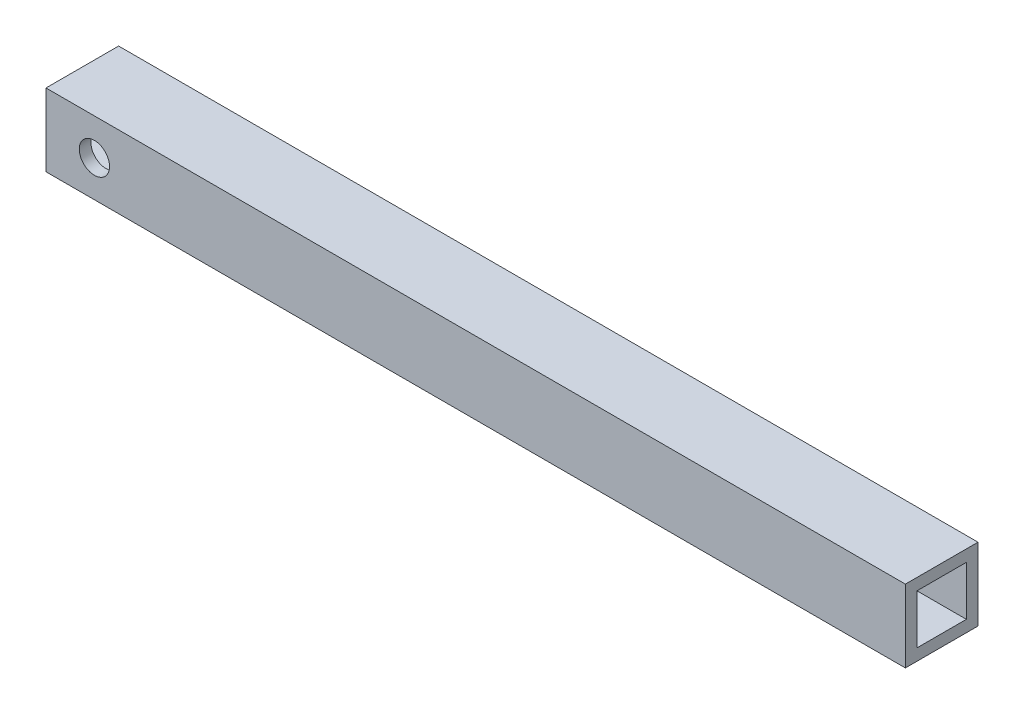
ISO-10303-21;
HEADER;
FILE_DESCRIPTION(('STEP AP214'),'2;1');
FILE_NAME('part.step','',(''),(''),'','','');
FILE_SCHEMA(('AUTOMOTIVE_DESIGN { 1 0 10303 214 1 1 1 1 }'));
ENDSEC;
DATA;
#1=APPLICATION_CONTEXT('core data for automotive mechanical design processes');
#2=APPLICATION_PROTOCOL_DEFINITION('international standard','automotive_design',2000,#1);
#3=PRODUCT_CONTEXT('',#1,'mechanical');
#4=PRODUCT('Part','Part','',(#3));
#5=PRODUCT_RELATED_PRODUCT_CATEGORY('part','',(#4));
#6=PRODUCT_DEFINITION_FORMATION('','',#4);
#7=PRODUCT_DEFINITION_CONTEXT('part definition',#1,'design');
#8=PRODUCT_DEFINITION('design','',#6,#7);
#9=PRODUCT_DEFINITION_SHAPE('','',#8);
#10=(LENGTH_UNIT() NAMED_UNIT(*) SI_UNIT(.MILLI.,.METRE.));
#11=(NAMED_UNIT(*) PLANE_ANGLE_UNIT() SI_UNIT($,.RADIAN.));
#12=(NAMED_UNIT(*) SI_UNIT($,.STERADIAN.) SOLID_ANGLE_UNIT());
#13=UNCERTAINTY_MEASURE_WITH_UNIT(LENGTH_MEASURE(1.E-05),#10,'distance_accuracy_value','');
#14=(GEOMETRIC_REPRESENTATION_CONTEXT(3) GLOBAL_UNCERTAINTY_ASSIGNED_CONTEXT((#13)) GLOBAL_UNIT_ASSIGNED_CONTEXT((#10,
#11,#12)) REPRESENTATION_CONTEXT('',''));
#15=CARTESIAN_POINT('',(0.,0.,0.));
#16=DIRECTION('',(0.,0.,1.));
#17=DIRECTION('',(1.,0.,0.));
#18=AXIS2_PLACEMENT_3D('',#15,#16,#17);
#19=CARTESIAN_POINT('',(112.7125,9.525,-9.525));
#20=DIRECTION('',(0.,0.,1.));
#21=DIRECTION('',(0.,-1.,0.));
#22=AXIS2_PLACEMENT_3D('',#19,#20,#21);
#23=PLANE('',#22);
#24=CARTESIAN_POINT('',(-100.0125,0.,-9.525));
#25=DIRECTION('',(0.,0.,-1.));
#26=DIRECTION('',(0.,1.,0.));
#27=AXIS2_PLACEMENT_3D('',#24,#25,#26);
#28=CIRCLE('',#27,3.96875);
#29=CARTESIAN_POINT('',(-100.0125,3.96875,-9.525));
#30=VERTEX_POINT('',#29);
#31=EDGE_CURVE('E249',#30,#30,#28,.T.);
#32=ORIENTED_EDGE('',*,*,#31,.F.);
#33=EDGE_LOOP('',(#32));
#34=FACE_BOUND('',#33,.T.);
#35=DIRECTION('',(0.,1.,0.));
#36=VECTOR('',#35,1.);
#37=CARTESIAN_POINT('',(-112.7125,9.525,-9.525));
#38=LINE('',#37,#36);
#39=CARTESIAN_POINT('',(-112.7125,-9.525,-9.525));
#40=VERTEX_POINT('',#39);
#41=CARTESIAN_POINT('',(-112.7125,9.525,-9.525));
#42=VERTEX_POINT('',#41);
#43=EDGE_CURVE('E165',#40,#42,#38,.T.);
#44=ORIENTED_EDGE('',*,*,#43,.T.);
#45=DIRECTION('',(-1.,0.,0.));
#46=VECTOR('',#45,1.);
#47=CARTESIAN_POINT('',(112.7125,9.525,-9.525));
#48=LINE('',#47,#46);
#49=CARTESIAN_POINT('',(112.7125,9.525,-9.525));
#50=VERTEX_POINT('',#49);
#51=EDGE_CURVE('E11',#50,#42,#48,.T.);
#52=ORIENTED_EDGE('',*,*,#51,.F.);
#53=DIRECTION('',(0.,1.,0.));
#54=VECTOR('',#53,1.);
#55=CARTESIAN_POINT('',(112.7125,9.525,-9.525));
#56=LINE('',#55,#54);
#57=CARTESIAN_POINT('',(112.7125,-9.525,-9.525));
#58=VERTEX_POINT('',#57);
#59=EDGE_CURVE('E150',#58,#50,#56,.T.);
#60=ORIENTED_EDGE('',*,*,#59,.F.);
#61=DIRECTION('',(-1.,0.,0.));
#62=VECTOR('',#61,1.);
#63=CARTESIAN_POINT('',(112.7125,-9.525,-9.525));
#64=LINE('',#63,#62);
#65=EDGE_CURVE('E164',#58,#40,#64,.T.);
#66=ORIENTED_EDGE('',*,*,#65,.T.);
#67=EDGE_LOOP('',(#44,#52,#60,#66));
#68=FACE_BOUND('',#67,.T.);
#69=ADVANCED_FACE('F41',(#34,#68),#23,.F.);
#70=CARTESIAN_POINT('',(112.7125,9.525,9.525));
#71=DIRECTION('',(0.,-1.,0.));
#72=DIRECTION('',(0.,0.,-1.));
#73=AXIS2_PLACEMENT_3D('',#70,#71,#72);
#74=PLANE('',#73);
#75=DIRECTION('',(0.,0.,1.));
#76=VECTOR('',#75,1.);
#77=CARTESIAN_POINT('',(-112.7125,9.525,9.525));
#78=LINE('',#77,#76);
#79=CARTESIAN_POINT('',(-112.7125,9.525,9.525));
#80=VERTEX_POINT('',#79);
#81=EDGE_CURVE('E169',#42,#80,#78,.T.);
#82=ORIENTED_EDGE('',*,*,#81,.T.);
#83=DIRECTION('',(-1.,0.,0.));
#84=VECTOR('',#83,1.);
#85=CARTESIAN_POINT('',(112.7125,9.525,9.525));
#86=LINE('',#85,#84);
#87=CARTESIAN_POINT('',(112.7125,9.525,9.525));
#88=VERTEX_POINT('',#87);
#89=EDGE_CURVE('E50',#88,#80,#86,.T.);
#90=ORIENTED_EDGE('',*,*,#89,.F.);
#91=DIRECTION('',(0.,0.,1.));
#92=VECTOR('',#91,1.);
#93=CARTESIAN_POINT('',(112.7125,9.525,9.525));
#94=LINE('',#93,#92);
#95=EDGE_CURVE('E154',#50,#88,#94,.T.);
#96=ORIENTED_EDGE('',*,*,#95,.F.);
#97=ORIENTED_EDGE('',*,*,#51,.T.);
#98=EDGE_LOOP('',(#82,#90,#96,#97));
#99=FACE_BOUND('',#98,.T.);
#100=ADVANCED_FACE('F204',(#99),#74,.F.);
#101=CARTESIAN_POINT('',(112.7125,9.525,9.525));
#102=DIRECTION('',(0.,0.,-1.));
#103=DIRECTION('',(0.,1.,0.));
#104=AXIS2_PLACEMENT_3D('',#101,#102,#103);
#105=PLANE('',#104);
#106=CARTESIAN_POINT('',(-100.0125,0.,9.525));
#107=DIRECTION('',(0.,0.,-1.));
#108=DIRECTION('',(0.,1.,0.));
#109=AXIS2_PLACEMENT_3D('',#106,#107,#108);
#110=CIRCLE('',#109,3.96875);
#111=CARTESIAN_POINT('',(-100.0125,3.96875,9.525));
#112=VERTEX_POINT('',#111);
#113=EDGE_CURVE('E247',#112,#112,#110,.F.);
#114=ORIENTED_EDGE('',*,*,#113,.F.);
#115=EDGE_LOOP('',(#114));
#116=FACE_BOUND('',#115,.T.);
#117=DIRECTION('',(0.,-1.,0.));
#118=VECTOR('',#117,1.);
#119=CARTESIAN_POINT('',(-112.7125,9.525,9.525));
#120=LINE('',#119,#118);
#121=CARTESIAN_POINT('',(-112.7125,-9.525,9.525));
#122=VERTEX_POINT('',#121);
#123=EDGE_CURVE('E172',#80,#122,#120,.T.);
#124=ORIENTED_EDGE('',*,*,#123,.T.);
#125=DIRECTION('',(-1.,0.,0.));
#126=VECTOR('',#125,1.);
#127=CARTESIAN_POINT('',(112.7125,-9.525,9.525));
#128=LINE('',#127,#126);
#129=CARTESIAN_POINT('',(112.7125,-9.525,9.525));
#130=VERTEX_POINT('',#129);
#131=EDGE_CURVE('E180',#130,#122,#128,.T.);
#132=ORIENTED_EDGE('',*,*,#131,.F.);
#133=DIRECTION('',(0.,-1.,0.));
#134=VECTOR('',#133,1.);
#135=CARTESIAN_POINT('',(112.7125,9.525,9.525));
#136=LINE('',#135,#134);
#137=EDGE_CURVE('E158',#88,#130,#136,.T.);
#138=ORIENTED_EDGE('',*,*,#137,.F.);
#139=ORIENTED_EDGE('',*,*,#89,.T.);
#140=EDGE_LOOP('',(#124,#132,#138,#139));
#141=FACE_BOUND('',#140,.T.);
#142=ADVANCED_FACE('F190',(#116,#141),#105,.F.);
#143=CARTESIAN_POINT('',(112.7125,-9.525,9.525));
#144=DIRECTION('',(0.,1.,0.));
#145=DIRECTION('',(0.,0.,1.));
#146=AXIS2_PLACEMENT_3D('',#143,#144,#145);
#147=PLANE('',#146);
#148=DIRECTION('',(0.,0.,-1.));
#149=VECTOR('',#148,1.);
#150=CARTESIAN_POINT('',(-112.7125,-9.525,9.525));
#151=LINE('',#150,#149);
#152=EDGE_CURVE('E155',#122,#40,#151,.T.);
#153=ORIENTED_EDGE('',*,*,#152,.T.);
#154=ORIENTED_EDGE('',*,*,#65,.F.);
#155=DIRECTION('',(0.,0.,-1.));
#156=VECTOR('',#155,1.);
#157=CARTESIAN_POINT('',(112.7125,-9.525,9.525));
#158=LINE('',#157,#156);
#159=EDGE_CURVE('E161',#130,#58,#158,.T.);
#160=ORIENTED_EDGE('',*,*,#159,.F.);
#161=ORIENTED_EDGE('',*,*,#131,.T.);
#162=EDGE_LOOP('',(#153,#154,#160,#161));
#163=FACE_BOUND('',#162,.T.);
#164=ADVANCED_FACE('F197',(#163),#147,.F.);
#165=CARTESIAN_POINT('',(112.7125,0.,0.));
#166=DIRECTION('',(1.,0.,0.));
#167=DIRECTION('',(0.,0.,-1.));
#168=AXIS2_PLACEMENT_3D('',#165,#166,#167);
#169=PLANE('',#168);
#170=DIRECTION('',(0.,1.,0.));
#171=VECTOR('',#170,1.);
#172=CARTESIAN_POINT('',(112.7125,9.525,-6.477));
#173=LINE('',#172,#171);
#174=CARTESIAN_POINT('',(112.7125,-6.477,-6.477));
#175=VERTEX_POINT('',#174);
#176=CARTESIAN_POINT('',(112.7125,6.477,-6.477));
#177=VERTEX_POINT('',#176);
#178=EDGE_CURVE('E132',#175,#177,#173,.T.);
#179=ORIENTED_EDGE('',*,*,#178,.F.);
#180=DIRECTION('',(0.,0.,-1.));
#181=VECTOR('',#180,1.);
#182=CARTESIAN_POINT('',(112.7125,-6.477,9.525));
#183=LINE('',#182,#181);
#184=CARTESIAN_POINT('',(112.7125,-6.477,6.477));
#185=VERTEX_POINT('',#184);
#186=EDGE_CURVE('E112',#185,#175,#183,.T.);
#187=ORIENTED_EDGE('',*,*,#186,.F.);
#188=DIRECTION('',(0.,-1.,0.));
#189=VECTOR('',#188,1.);
#190=CARTESIAN_POINT('',(112.7125,9.525,6.477));
#191=LINE('',#190,#189);
#192=CARTESIAN_POINT('',(112.7125,6.477,6.477));
#193=VERTEX_POINT('',#192);
#194=EDGE_CURVE('E145',#193,#185,#191,.T.);
#195=ORIENTED_EDGE('',*,*,#194,.F.);
#196=DIRECTION('',(0.,0.,1.));
#197=VECTOR('',#196,1.);
#198=CARTESIAN_POINT('',(112.7125,6.477,9.525));
#199=LINE('',#198,#197);
#200=EDGE_CURVE('E136',#177,#193,#199,.T.);
#201=ORIENTED_EDGE('',*,*,#200,.F.);
#202=EDGE_LOOP('',(#179,#187,#195,#201));
#203=FACE_BOUND('',#202,.T.);
#204=ORIENTED_EDGE('',*,*,#59,.T.);
#205=ORIENTED_EDGE('',*,*,#95,.T.);
#206=ORIENTED_EDGE('',*,*,#137,.T.);
#207=ORIENTED_EDGE('',*,*,#159,.T.);
#208=EDGE_LOOP('',(#204,#205,#206,#207));
#209=FACE_BOUND('',#208,.T.);
#210=ADVANCED_FACE('F203',(#203,#209),#169,.T.);
#211=CARTESIAN_POINT('',(-112.7125,0.,0.));
#212=DIRECTION('',(1.,0.,0.));
#213=DIRECTION('',(0.,0.,-1.));
#214=AXIS2_PLACEMENT_3D('',#211,#212,#213);
#215=PLANE('',#214);
#216=DIRECTION('',(0.,0.,-1.));
#217=VECTOR('',#216,1.);
#218=CARTESIAN_POINT('',(-112.7125,-6.477,9.525));
#219=LINE('',#218,#217);
#220=CARTESIAN_POINT('',(-112.7125,-6.477,6.477));
#221=VERTEX_POINT('',#220);
#222=CARTESIAN_POINT('',(-112.7125,-6.477,-6.477));
#223=VERTEX_POINT('',#222);
#224=EDGE_CURVE('E110',#221,#223,#219,.T.);
#225=ORIENTED_EDGE('',*,*,#224,.T.);
#226=DIRECTION('',(0.,1.,0.));
#227=VECTOR('',#226,1.);
#228=CARTESIAN_POINT('',(-112.7125,9.525,-6.477));
#229=LINE('',#228,#227);
#230=CARTESIAN_POINT('',(-112.7125,6.477,-6.477));
#231=VERTEX_POINT('',#230);
#232=EDGE_CURVE('E119',#223,#231,#229,.T.);
#233=ORIENTED_EDGE('',*,*,#232,.T.);
#234=DIRECTION('',(0.,0.,1.));
#235=VECTOR('',#234,1.);
#236=CARTESIAN_POINT('',(-112.7125,6.477,9.525));
#237=LINE('',#236,#235);
#238=CARTESIAN_POINT('',(-112.7125,6.477,6.477));
#239=VERTEX_POINT('',#238);
#240=EDGE_CURVE('E126',#231,#239,#237,.T.);
#241=ORIENTED_EDGE('',*,*,#240,.T.);
#242=DIRECTION('',(0.,-1.,0.));
#243=VECTOR('',#242,1.);
#244=CARTESIAN_POINT('',(-112.7125,9.525,6.477));
#245=LINE('',#244,#243);
#246=EDGE_CURVE('E64',#239,#221,#245,.T.);
#247=ORIENTED_EDGE('',*,*,#246,.T.);
#248=EDGE_LOOP('',(#225,#233,#241,#247));
#249=FACE_BOUND('',#248,.T.);
#250=ORIENTED_EDGE('',*,*,#43,.F.);
#251=ORIENTED_EDGE('',*,*,#152,.F.);
#252=ORIENTED_EDGE('',*,*,#123,.F.);
#253=ORIENTED_EDGE('',*,*,#81,.F.);
#254=EDGE_LOOP('',(#250,#251,#252,#253));
#255=FACE_BOUND('',#254,.T.);
#256=ADVANCED_FACE('F129',(#249,#255),#215,.F.);
#257=CARTESIAN_POINT('',(112.7125,9.525,-6.477));
#258=DIRECTION('',(0.,0.,1.));
#259=DIRECTION('',(0.,-1.,0.));
#260=AXIS2_PLACEMENT_3D('',#257,#258,#259);
#261=PLANE('',#260);
#262=CARTESIAN_POINT('',(-100.0125,0.,-6.477));
#263=DIRECTION('',(0.,0.,1.));
#264=DIRECTION('',(0.,-1.,0.));
#265=AXIS2_PLACEMENT_3D('',#262,#263,#264);
#266=CIRCLE('',#265,3.96875);
#267=CARTESIAN_POINT('',(-100.0125,3.96875,-6.477));
#268=VERTEX_POINT('',#267);
#269=EDGE_CURVE('E127',#268,#268,#266,.T.);
#270=ORIENTED_EDGE('',*,*,#269,.F.);
#271=EDGE_LOOP('',(#270));
#272=FACE_BOUND('',#271,.T.);
#273=ORIENTED_EDGE('',*,*,#232,.F.);
#274=DIRECTION('',(-1.,0.,0.));
#275=VECTOR('',#274,1.);
#276=CARTESIAN_POINT('',(112.7125,-6.477,-6.477));
#277=LINE('',#276,#275);
#278=EDGE_CURVE('E106',#175,#223,#277,.T.);
#279=ORIENTED_EDGE('',*,*,#278,.F.);
#280=ORIENTED_EDGE('',*,*,#178,.T.);
#281=DIRECTION('',(-1.,0.,0.));
#282=VECTOR('',#281,1.);
#283=CARTESIAN_POINT('',(112.7125,6.477,-6.477));
#284=LINE('',#283,#282);
#285=EDGE_CURVE('E122',#177,#231,#284,.T.);
#286=ORIENTED_EDGE('',*,*,#285,.T.);
#287=EDGE_LOOP('',(#273,#279,#280,#286));
#288=FACE_BOUND('',#287,.T.);
#289=ADVANCED_FACE('F120',(#272,#288),#261,.T.);
#290=CARTESIAN_POINT('',(112.7125,6.477,9.525));
#291=DIRECTION('',(0.,-1.,0.));
#292=DIRECTION('',(0.,0.,-1.));
#293=AXIS2_PLACEMENT_3D('',#290,#291,#292);
#294=PLANE('',#293);
#295=ORIENTED_EDGE('',*,*,#240,.F.);
#296=ORIENTED_EDGE('',*,*,#285,.F.);
#297=ORIENTED_EDGE('',*,*,#200,.T.);
#298=DIRECTION('',(-1.,0.,0.));
#299=VECTOR('',#298,1.);
#300=CARTESIAN_POINT('',(112.7125,6.477,6.477));
#301=LINE('',#300,#299);
#302=EDGE_CURVE('E260',#193,#239,#301,.T.);
#303=ORIENTED_EDGE('',*,*,#302,.T.);
#304=EDGE_LOOP('',(#295,#296,#297,#303));
#305=FACE_BOUND('',#304,.T.);
#306=ADVANCED_FACE('F227',(#305),#294,.T.);
#307=CARTESIAN_POINT('',(112.7125,9.525,6.477));
#308=DIRECTION('',(0.,0.,-1.));
#309=DIRECTION('',(0.,1.,0.));
#310=AXIS2_PLACEMENT_3D('',#307,#308,#309);
#311=PLANE('',#310);
#312=CARTESIAN_POINT('',(-100.0125,0.,6.477));
#313=DIRECTION('',(0.,0.,-1.));
#314=DIRECTION('',(0.,1.,0.));
#315=AXIS2_PLACEMENT_3D('',#312,#313,#314);
#316=CIRCLE('',#315,3.96875);
#317=CARTESIAN_POINT('',(-100.0125,3.96875,6.477));
#318=VERTEX_POINT('',#317);
#319=EDGE_CURVE('E44',#318,#318,#316,.T.);
#320=ORIENTED_EDGE('',*,*,#319,.F.);
#321=EDGE_LOOP('',(#320));
#322=FACE_BOUND('',#321,.T.);
#323=ORIENTED_EDGE('',*,*,#246,.F.);
#324=ORIENTED_EDGE('',*,*,#302,.F.);
#325=ORIENTED_EDGE('',*,*,#194,.T.);
#326=DIRECTION('',(-1.,0.,0.));
#327=VECTOR('',#326,1.);
#328=CARTESIAN_POINT('',(112.7125,-6.477,6.477));
#329=LINE('',#328,#327);
#330=EDGE_CURVE('E57',#185,#221,#329,.T.);
#331=ORIENTED_EDGE('',*,*,#330,.T.);
#332=EDGE_LOOP('',(#323,#324,#325,#331));
#333=FACE_BOUND('',#332,.T.);
#334=ADVANCED_FACE('F224',(#322,#333),#311,.T.);
#335=CARTESIAN_POINT('',(112.7125,-6.477,9.525));
#336=DIRECTION('',(0.,1.,0.));
#337=DIRECTION('',(0.,0.,1.));
#338=AXIS2_PLACEMENT_3D('',#335,#336,#337);
#339=PLANE('',#338);
#340=ORIENTED_EDGE('',*,*,#224,.F.);
#341=ORIENTED_EDGE('',*,*,#330,.F.);
#342=ORIENTED_EDGE('',*,*,#186,.T.);
#343=ORIENTED_EDGE('',*,*,#278,.T.);
#344=EDGE_LOOP('',(#340,#341,#342,#343));
#345=FACE_BOUND('',#344,.T.);
#346=ADVANCED_FACE('F108',(#345),#339,.T.);
#347=CARTESIAN_POINT('',(-100.0125,0.,20.7503201513365));
#348=DIRECTION('',(0.,0.,-1.));
#349=DIRECTION('',(0.,1.,0.));
#350=AXIS2_PLACEMENT_3D('',#347,#348,#349);
#351=CYLINDRICAL_SURFACE('',#350,3.96875);
#352=CARTESIAN_POINT('',(-100.0125,3.96875,6.477));
#353=CARTESIAN_POINT('',(-100.0125,3.96875,6.50875));
#354=CARTESIAN_POINT('',(-100.0125,3.96875,6.5405));
#355=CARTESIAN_POINT('',(-100.0125,3.96875,6.604));
#356=CARTESIAN_POINT('',(-100.0125,3.96875,6.63575));
#357=CARTESIAN_POINT('',(-100.0125,3.96875,6.69925));
#358=CARTESIAN_POINT('',(-100.0125,3.96875,6.731));
#359=CARTESIAN_POINT('',(-100.0125,3.96875,6.7945));
#360=CARTESIAN_POINT('',(-100.0125,3.96875,6.82625));
#361=CARTESIAN_POINT('',(-100.0125,3.96875,6.88975));
#362=CARTESIAN_POINT('',(-100.0125,3.96875,6.9215));
#363=CARTESIAN_POINT('',(-100.0125,3.96875,6.985));
#364=CARTESIAN_POINT('',(-100.0125,3.96875,7.01675));
#365=CARTESIAN_POINT('',(-100.0125,3.96875,7.08025));
#366=CARTESIAN_POINT('',(-100.0125,3.96875,7.112));
#367=CARTESIAN_POINT('',(-100.0125,3.96875,7.1755));
#368=CARTESIAN_POINT('',(-100.0125,3.96875,7.20725));
#369=CARTESIAN_POINT('',(-100.0125,3.96875,7.27075));
#370=CARTESIAN_POINT('',(-100.0125,3.96875,7.3025));
#371=CARTESIAN_POINT('',(-100.0125,3.96875,7.366));
#372=CARTESIAN_POINT('',(-100.0125,3.96875,7.39775));
#373=CARTESIAN_POINT('',(-100.0125,3.96875,7.46125));
#374=CARTESIAN_POINT('',(-100.0125,3.96875,7.493));
#375=CARTESIAN_POINT('',(-100.0125,3.96875,7.5565));
#376=CARTESIAN_POINT('',(-100.0125,3.96875,7.58825));
#377=CARTESIAN_POINT('',(-100.0125,3.96875,7.65175));
#378=CARTESIAN_POINT('',(-100.0125,3.96875,7.6835));
#379=CARTESIAN_POINT('',(-100.0125,3.96875,7.747));
#380=CARTESIAN_POINT('',(-100.0125,3.96875,7.77875));
#381=CARTESIAN_POINT('',(-100.0125,3.96875,7.84225));
#382=CARTESIAN_POINT('',(-100.0125,3.96875,7.874));
#383=CARTESIAN_POINT('',(-100.0125,3.96875,7.9375));
#384=CARTESIAN_POINT('',(-100.0125,3.96875,7.96925));
#385=CARTESIAN_POINT('',(-100.0125,3.96875,8.03275));
#386=CARTESIAN_POINT('',(-100.0125,3.96875,8.0645));
#387=CARTESIAN_POINT('',(-100.0125,3.96875,8.128));
#388=CARTESIAN_POINT('',(-100.0125,3.96875,8.15975));
#389=CARTESIAN_POINT('',(-100.0125,3.96875,8.22325));
#390=CARTESIAN_POINT('',(-100.0125,3.96875,8.255));
#391=CARTESIAN_POINT('',(-100.0125,3.96875,8.3185));
#392=CARTESIAN_POINT('',(-100.0125,3.96875,8.35025));
#393=CARTESIAN_POINT('',(-100.0125,3.96875,8.41375));
#394=CARTESIAN_POINT('',(-100.0125,3.96875,8.4455));
#395=CARTESIAN_POINT('',(-100.0125,3.96875,8.509));
#396=CARTESIAN_POINT('',(-100.0125,3.96875,8.54075));
#397=CARTESIAN_POINT('',(-100.0125,3.96875,8.60425));
#398=CARTESIAN_POINT('',(-100.0125,3.96875,8.636));
#399=CARTESIAN_POINT('',(-100.0125,3.96875,8.6995));
#400=CARTESIAN_POINT('',(-100.0125,3.96875,8.73125));
#401=CARTESIAN_POINT('',(-100.0125,3.96875,8.79475));
#402=CARTESIAN_POINT('',(-100.0125,3.96875,8.8265));
#403=CARTESIAN_POINT('',(-100.0125,3.96875,8.89));
#404=CARTESIAN_POINT('',(-100.0125,3.96875,8.92175));
#405=CARTESIAN_POINT('',(-100.0125,3.96875,8.98525));
#406=CARTESIAN_POINT('',(-100.0125,3.96875,9.017));
#407=CARTESIAN_POINT('',(-100.0125,3.96875,9.0805));
#408=CARTESIAN_POINT('',(-100.0125,3.96875,9.11225));
#409=CARTESIAN_POINT('',(-100.0125,3.96875,9.17575));
#410=CARTESIAN_POINT('',(-100.0125,3.96875,9.2075));
#411=CARTESIAN_POINT('',(-100.0125,3.96875,9.271));
#412=CARTESIAN_POINT('',(-100.0125,3.96875,9.30275));
#413=CARTESIAN_POINT('',(-100.0125,3.96875,9.36625));
#414=CARTESIAN_POINT('',(-100.0125,3.96875,9.398));
#415=CARTESIAN_POINT('',(-100.0125,3.96875,9.4615));
#416=CARTESIAN_POINT('',(-100.0125,3.96875,9.49325));
#417=CARTESIAN_POINT('',(-100.0125,3.96875,9.525));
#418=B_SPLINE_CURVE_WITH_KNOTS('',3,(#352,#353,#354,#355,#356,#357,#358,#359,#360,#361,#362,
#363,#364,#365,#366,#367,#368,#369,#370,#371,#372,#373,#374,#375,#376,#377,#378,#379,#380,#381,
#382,#383,#384,#385,#386,#387,#388,#389,#390,#391,#392,#393,#394,#395,#396,#397,#398,#399,#400,
#401,#402,#403,#404,#405,#406,#407,#408,#409,#410,#411,#412,#413,#414,#415,#416,#417),
.UNSPECIFIED.,.F.,.F.,(4,2,2,2,2,2,2,2,2,2,2,2,2,2,2,2,2,2,2,2,2,2,2,2,2,2,2,2,2,2,2,2,4),(0.,
0.0952499999999998,0.1905,0.28575,0.380999999999999,0.476249999999999,0.571499999999999,
0.666749999999999,0.761999999999999,0.85725,0.9525,1.04775,1.143,1.23825,1.3335,1.42875,1.524,
1.61925,1.7145,1.80975,1.905,2.00025,2.0955,2.19075,2.286,2.38125,2.4765,2.57175,2.667,2.76225,
2.8575,2.95275,3.048),.UNSPECIFIED.);
#419=EDGE_CURVE('BSEAM223',#318,#112,#418,.T.);
#420=ORIENTED_EDGE('',*,*,#319,.T.);
#421=ORIENTED_EDGE('',*,*,#113,.T.);
#422=ORIENTED_EDGE('',*,*,#419,.T.);
#423=ORIENTED_EDGE('',*,*,#419,.F.);
#424=EDGE_LOOP('',(#420,#422,#421,#423));
#425=FACE_BOUND('',#424,.T.);
#426=ADVANCED_FACE('F223',(#425),#351,.F.);
#427=CARTESIAN_POINT('',(-100.0125,3.96875,-6.477));
#428=CARTESIAN_POINT('',(-100.0125,3.96875,-6.50875));
#429=CARTESIAN_POINT('',(-100.0125,3.96875,-6.5405));
#430=CARTESIAN_POINT('',(-100.0125,3.96875,-6.604));
#431=CARTESIAN_POINT('',(-100.0125,3.96875,-6.63575));
#432=CARTESIAN_POINT('',(-100.0125,3.96875,-6.69925));
#433=CARTESIAN_POINT('',(-100.0125,3.96875,-6.731));
#434=CARTESIAN_POINT('',(-100.0125,3.96875,-6.7945));
#435=CARTESIAN_POINT('',(-100.0125,3.96875,-6.82625));
#436=CARTESIAN_POINT('',(-100.0125,3.96875,-6.88975));
#437=CARTESIAN_POINT('',(-100.0125,3.96875,-6.9215));
#438=CARTESIAN_POINT('',(-100.0125,3.96875,-6.985));
#439=CARTESIAN_POINT('',(-100.0125,3.96875,-7.01675));
#440=CARTESIAN_POINT('',(-100.0125,3.96875,-7.08025));
#441=CARTESIAN_POINT('',(-100.0125,3.96875,-7.112));
#442=CARTESIAN_POINT('',(-100.0125,3.96875,-7.1755));
#443=CARTESIAN_POINT('',(-100.0125,3.96875,-7.20725));
#444=CARTESIAN_POINT('',(-100.0125,3.96875,-7.27075));
#445=CARTESIAN_POINT('',(-100.0125,3.96875,-7.3025));
#446=CARTESIAN_POINT('',(-100.0125,3.96875,-7.366));
#447=CARTESIAN_POINT('',(-100.0125,3.96875,-7.39775));
#448=CARTESIAN_POINT('',(-100.0125,3.96875,-7.46125));
#449=CARTESIAN_POINT('',(-100.0125,3.96875,-7.493));
#450=CARTESIAN_POINT('',(-100.0125,3.96875,-7.5565));
#451=CARTESIAN_POINT('',(-100.0125,3.96875,-7.58825));
#452=CARTESIAN_POINT('',(-100.0125,3.96875,-7.65175));
#453=CARTESIAN_POINT('',(-100.0125,3.96875,-7.6835));
#454=CARTESIAN_POINT('',(-100.0125,3.96875,-7.747));
#455=CARTESIAN_POINT('',(-100.0125,3.96875,-7.77875));
#456=CARTESIAN_POINT('',(-100.0125,3.96875,-7.84225));
#457=CARTESIAN_POINT('',(-100.0125,3.96875,-7.874));
#458=CARTESIAN_POINT('',(-100.0125,3.96875,-7.9375));
#459=CARTESIAN_POINT('',(-100.0125,3.96875,-7.96925));
#460=CARTESIAN_POINT('',(-100.0125,3.96875,-8.03275));
#461=CARTESIAN_POINT('',(-100.0125,3.96875,-8.0645));
#462=CARTESIAN_POINT('',(-100.0125,3.96875,-8.128));
#463=CARTESIAN_POINT('',(-100.0125,3.96875,-8.15975));
#464=CARTESIAN_POINT('',(-100.0125,3.96875,-8.22325));
#465=CARTESIAN_POINT('',(-100.0125,3.96875,-8.255));
#466=CARTESIAN_POINT('',(-100.0125,3.96875,-8.3185));
#467=CARTESIAN_POINT('',(-100.0125,3.96875,-8.35025));
#468=CARTESIAN_POINT('',(-100.0125,3.96875,-8.41375));
#469=CARTESIAN_POINT('',(-100.0125,3.96875,-8.4455));
#470=CARTESIAN_POINT('',(-100.0125,3.96875,-8.509));
#471=CARTESIAN_POINT('',(-100.0125,3.96875,-8.54075));
#472=CARTESIAN_POINT('',(-100.0125,3.96875,-8.60425));
#473=CARTESIAN_POINT('',(-100.0125,3.96875,-8.636));
#474=CARTESIAN_POINT('',(-100.0125,3.96875,-8.6995));
#475=CARTESIAN_POINT('',(-100.0125,3.96875,-8.73125));
#476=CARTESIAN_POINT('',(-100.0125,3.96875,-8.79475));
#477=CARTESIAN_POINT('',(-100.0125,3.96875,-8.8265));
#478=CARTESIAN_POINT('',(-100.0125,3.96875,-8.89));
#479=CARTESIAN_POINT('',(-100.0125,3.96875,-8.92175));
#480=CARTESIAN_POINT('',(-100.0125,3.96875,-8.98525));
#481=CARTESIAN_POINT('',(-100.0125,3.96875,-9.017));
#482=CARTESIAN_POINT('',(-100.0125,3.96875,-9.0805));
#483=CARTESIAN_POINT('',(-100.0125,3.96875,-9.11225));
#484=CARTESIAN_POINT('',(-100.0125,3.96875,-9.17575));
#485=CARTESIAN_POINT('',(-100.0125,3.96875,-9.2075));
#486=CARTESIAN_POINT('',(-100.0125,3.96875,-9.271));
#487=CARTESIAN_POINT('',(-100.0125,3.96875,-9.30275));
#488=CARTESIAN_POINT('',(-100.0125,3.96875,-9.36625));
#489=CARTESIAN_POINT('',(-100.0125,3.96875,-9.398));
#490=CARTESIAN_POINT('',(-100.0125,3.96875,-9.4615));
#491=CARTESIAN_POINT('',(-100.0125,3.96875,-9.49325));
#492=CARTESIAN_POINT('',(-100.0125,3.96875,-9.525));
#493=B_SPLINE_CURVE_WITH_KNOTS('',3,(#427,#428,#429,#430,#431,#432,#433,#434,#435,#436,#437,
#438,#439,#440,#441,#442,#443,#444,#445,#446,#447,#448,#449,#450,#451,#452,#453,#454,#455,#456,
#457,#458,#459,#460,#461,#462,#463,#464,#465,#466,#467,#468,#469,#470,#471,#472,#473,#474,#475,
#476,#477,#478,#479,#480,#481,#482,#483,#484,#485,#486,#487,#488,#489,#490,#491,#492),
.UNSPECIFIED.,.F.,.F.,(4,2,2,2,2,2,2,2,2,2,2,2,2,2,2,2,2,2,2,2,2,2,2,2,2,2,2,2,2,2,2,2,4),(0.,
0.0952500000000016,0.1905,0.285750000000001,0.380999999999999,0.476250000000001,
0.571499999999999,0.666750000000001,0.761999999999999,0.85725,0.952500000000002,1.04775,1.143,
1.23825,1.3335,1.42875,1.524,1.61925,1.7145,1.80975,1.905,2.00025,2.0955,2.19075,2.286,2.38125,
2.4765,2.57175,2.667,2.76225,2.8575,2.95275,3.048),.UNSPECIFIED.);
#494=EDGE_CURVE('BSEAM236',#268,#30,#493,.T.);
#495=ORIENTED_EDGE('',*,*,#269,.T.);
#496=ORIENTED_EDGE('',*,*,#31,.T.);
#497=ORIENTED_EDGE('',*,*,#494,.T.);
#498=ORIENTED_EDGE('',*,*,#494,.F.);
#499=EDGE_LOOP('',(#495,#497,#496,#498));
#500=FACE_BOUND('',#499,.T.);
#501=ADVANCED_FACE('F236',(#500),#351,.F.);
#502=CLOSED_SHELL('',(#69,#100,#142,#164,#210,#256,#289,#306,#334,#346,#426,#501));
#503=MANIFOLD_SOLID_BREP('B2',#502);
#504=ADVANCED_BREP_SHAPE_REPRESENTATION('',(#18,#503),#14);
#505=SHAPE_DEFINITION_REPRESENTATION(#9,#504);
ENDSEC;
END-ISO-10303-21;
